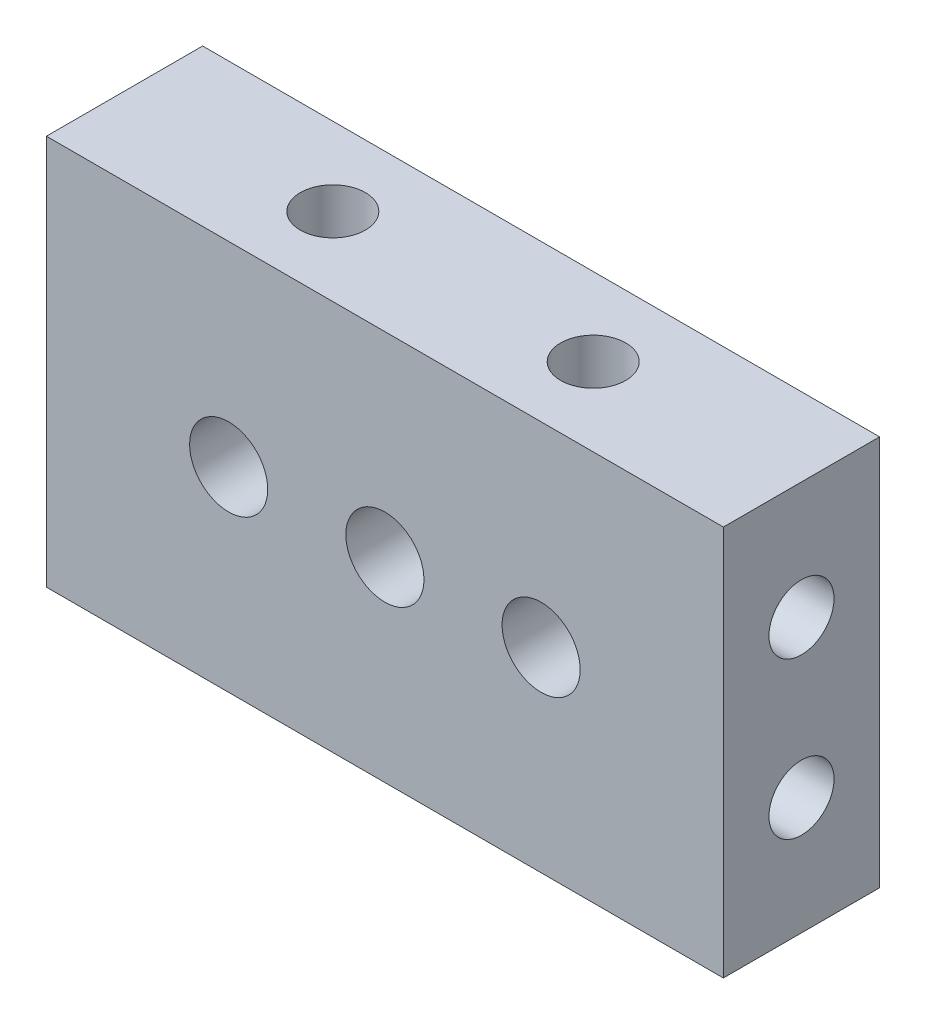
ISO-10303-21;
HEADER;
FILE_DESCRIPTION(('STEP AP214'),'2;1');
FILE_NAME('part.step','',(''),(''),'','','');
FILE_SCHEMA(('AUTOMOTIVE_DESIGN { 1 0 10303 214 1 1 1 1 }'));
ENDSEC;
DATA;
#1=APPLICATION_CONTEXT('core data for automotive mechanical design processes');
#2=APPLICATION_PROTOCOL_DEFINITION('international standard','automotive_design',2000,#1);
#3=PRODUCT_CONTEXT('',#1,'mechanical');
#4=PRODUCT('Part','Part','',(#3));
#5=PRODUCT_RELATED_PRODUCT_CATEGORY('part','',(#4));
#6=PRODUCT_DEFINITION_FORMATION('','',#4);
#7=PRODUCT_DEFINITION_CONTEXT('part definition',#1,'design');
#8=PRODUCT_DEFINITION('design','',#6,#7);
#9=PRODUCT_DEFINITION_SHAPE('','',#8);
#10=(LENGTH_UNIT() NAMED_UNIT(*) SI_UNIT(.MILLI.,.METRE.));
#11=(NAMED_UNIT(*) PLANE_ANGLE_UNIT() SI_UNIT($,.RADIAN.));
#12=(NAMED_UNIT(*) SI_UNIT($,.STERADIAN.) SOLID_ANGLE_UNIT());
#13=UNCERTAINTY_MEASURE_WITH_UNIT(LENGTH_MEASURE(1.E-05),#10,'distance_accuracy_value','');
#14=(GEOMETRIC_REPRESENTATION_CONTEXT(3) GLOBAL_UNCERTAINTY_ASSIGNED_CONTEXT((#13)) GLOBAL_UNIT_ASSIGNED_CONTEXT((#10,
#11,#12)) REPRESENTATION_CONTEXT('',''));
#15=CARTESIAN_POINT('',(0.,0.,0.));
#16=DIRECTION('',(0.,0.,1.));
#17=DIRECTION('',(1.,0.,0.));
#18=AXIS2_PLACEMENT_3D('',#15,#16,#17);
#19=CARTESIAN_POINT('',(13.,-7.5,5.));
#20=DIRECTION('',(-1.,0.,0.));
#21=DIRECTION('',(0.,0.,1.));
#22=AXIS2_PLACEMENT_3D('',#19,#20,#21);
#23=PLANE('',#22);
#24=CARTESIAN_POINT('',(13.,-3.,3.));
#25=DIRECTION('',(1.,0.,0.));
#26=DIRECTION('',(0.,0.,-1.));
#27=AXIS2_PLACEMENT_3D('',#24,#25,#26);
#28=CIRCLE('',#27,1.24999999999999);
#29=CARTESIAN_POINT('',(13.,-3.,1.75000000000001));
#30=VERTEX_POINT('',#29);
#31=EDGE_CURVE('E138',#30,#30,#28,.T.);
#32=ORIENTED_EDGE('',*,*,#31,.F.);
#33=EDGE_LOOP('',(#32));
#34=FACE_BOUND('',#33,.T.);
#35=CARTESIAN_POINT('',(13.,3.,3.));
#36=DIRECTION('',(1.,0.,0.));
#37=DIRECTION('',(0.,0.,-1.));
#38=AXIS2_PLACEMENT_3D('',#35,#36,#37);
#39=CIRCLE('',#38,1.24999999999999);
#40=CARTESIAN_POINT('',(13.,3.,1.75000000000001));
#41=VERTEX_POINT('',#40);
#42=EDGE_CURVE('E144',#41,#41,#39,.T.);
#43=ORIENTED_EDGE('',*,*,#42,.F.);
#44=EDGE_LOOP('',(#43));
#45=FACE_BOUND('',#44,.T.);
#46=DIRECTION('',(0.,1.,0.));
#47=VECTOR('',#46,1.);
#48=CARTESIAN_POINT('',(13.,-7.5,0.));
#49=LINE('',#48,#47);
#50=CARTESIAN_POINT('',(13.,-7.5,0.));
#51=VERTEX_POINT('',#50);
#52=CARTESIAN_POINT('',(13.,7.5,0.));
#53=VERTEX_POINT('',#52);
#54=EDGE_CURVE('E174',#51,#53,#49,.T.);
#55=ORIENTED_EDGE('',*,*,#54,.T.);
#56=DIRECTION('',(0.,0.,-1.));
#57=VECTOR('',#56,1.);
#58=CARTESIAN_POINT('',(13.,7.5,5.));
#59=LINE('',#58,#57);
#60=CARTESIAN_POINT('',(13.,7.5,6.));
#61=VERTEX_POINT('',#60);
#62=EDGE_CURVE('E192',#61,#53,#59,.T.);
#63=ORIENTED_EDGE('',*,*,#62,.F.);
#64=DIRECTION('',(0.,1.,0.));
#65=VECTOR('',#64,1.);
#66=CARTESIAN_POINT('',(13.,0.,6.));
#67=LINE('',#66,#65);
#68=CARTESIAN_POINT('',(13.,-7.5,6.));
#69=VERTEX_POINT('',#68);
#70=EDGE_CURVE('E165',#69,#61,#67,.T.);
#71=ORIENTED_EDGE('',*,*,#70,.F.);
#72=DIRECTION('',(0.,0.,-1.));
#73=VECTOR('',#72,1.);
#74=CARTESIAN_POINT('',(13.,-7.5,5.));
#75=LINE('',#74,#73);
#76=EDGE_CURVE('E183',#69,#51,#75,.T.);
#77=ORIENTED_EDGE('',*,*,#76,.T.);
#78=EDGE_LOOP('',(#55,#63,#71,#77));
#79=FACE_BOUND('',#78,.T.);
#80=ADVANCED_FACE('F39',(#34,#45,#79),#23,.F.);
#81=CARTESIAN_POINT('',(-13.,7.5,5.));
#82=DIRECTION('',(0.,-1.,0.));
#83=DIRECTION('',(0.,0.,-1.));
#84=AXIS2_PLACEMENT_3D('',#81,#82,#83);
#85=PLANE('',#84);
#86=CARTESIAN_POINT('',(5.,7.5,3.));
#87=DIRECTION('',(0.,1.,0.));
#88=DIRECTION('',(0.,0.,1.));
#89=AXIS2_PLACEMENT_3D('',#86,#87,#88);
#90=CIRCLE('',#89,1.24999999999999);
#91=CARTESIAN_POINT('',(5.,7.5,4.24999999999999));
#92=VERTEX_POINT('',#91);
#93=EDGE_CURVE('E112',#92,#92,#90,.T.);
#94=ORIENTED_EDGE('',*,*,#93,.F.);
#95=EDGE_LOOP('',(#94));
#96=FACE_BOUND('',#95,.T.);
#97=CARTESIAN_POINT('',(-5.,7.5,3.));
#98=DIRECTION('',(0.,1.,0.));
#99=DIRECTION('',(0.,0.,1.));
#100=AXIS2_PLACEMENT_3D('',#97,#98,#99);
#101=CIRCLE('',#100,1.24999999999999);
#102=CARTESIAN_POINT('',(-5.,7.5,4.24999999999999));
#103=VERTEX_POINT('',#102);
#104=EDGE_CURVE('E111',#103,#103,#101,.T.);
#105=ORIENTED_EDGE('',*,*,#104,.F.);
#106=EDGE_LOOP('',(#105));
#107=FACE_BOUND('',#106,.T.);
#108=DIRECTION('',(-1.,0.,0.));
#109=VECTOR('',#108,1.);
#110=CARTESIAN_POINT('',(-13.,7.5,0.));
#111=LINE('',#110,#109);
#112=CARTESIAN_POINT('',(-13.,7.5,0.));
#113=VERTEX_POINT('',#112);
#114=EDGE_CURVE('E177',#53,#113,#111,.T.);
#115=ORIENTED_EDGE('',*,*,#114,.T.);
#116=DIRECTION('',(0.,0.,-1.));
#117=VECTOR('',#116,1.);
#118=CARTESIAN_POINT('',(-13.,7.5,5.));
#119=LINE('',#118,#117);
#120=CARTESIAN_POINT('',(-13.,7.5,6.));
#121=VERTEX_POINT('',#120);
#122=EDGE_CURVE('E189',#121,#113,#119,.T.);
#123=ORIENTED_EDGE('',*,*,#122,.F.);
#124=DIRECTION('',(-1.,0.,0.));
#125=VECTOR('',#124,1.);
#126=CARTESIAN_POINT('',(0.,7.5,6.));
#127=LINE('',#126,#125);
#128=EDGE_CURVE('E168',#61,#121,#127,.T.);
#129=ORIENTED_EDGE('',*,*,#128,.F.);
#130=ORIENTED_EDGE('',*,*,#62,.T.);
#131=EDGE_LOOP('',(#115,#123,#129,#130));
#132=FACE_BOUND('',#131,.T.);
#133=ADVANCED_FACE('F237',(#96,#107,#132),#85,.F.);
#134=CARTESIAN_POINT('',(-13.,-7.5,5.));
#135=DIRECTION('',(1.,0.,0.));
#136=DIRECTION('',(0.,0.,-1.));
#137=AXIS2_PLACEMENT_3D('',#134,#135,#136);
#138=PLANE('',#137);
#139=CARTESIAN_POINT('',(-13.,-3.,3.));
#140=DIRECTION('',(-1.,0.,0.));
#141=DIRECTION('',(0.,0.,1.));
#142=AXIS2_PLACEMENT_3D('',#139,#140,#141);
#143=CIRCLE('',#142,1.24999999999999);
#144=CARTESIAN_POINT('',(-13.,-3.,4.24999999999999));
#145=VERTEX_POINT('',#144);
#146=EDGE_CURVE('E150',#145,#145,#143,.T.);
#147=ORIENTED_EDGE('',*,*,#146,.F.);
#148=EDGE_LOOP('',(#147));
#149=FACE_BOUND('',#148,.T.);
#150=CARTESIAN_POINT('',(-13.,3.,3.));
#151=DIRECTION('',(-1.,0.,0.));
#152=DIRECTION('',(0.,0.,1.));
#153=AXIS2_PLACEMENT_3D('',#150,#151,#152);
#154=CIRCLE('',#153,1.24999999999999);
#155=CARTESIAN_POINT('',(-13.,3.,4.24999999999999));
#156=VERTEX_POINT('',#155);
#157=EDGE_CURVE('E156',#156,#156,#154,.T.);
#158=ORIENTED_EDGE('',*,*,#157,.F.);
#159=EDGE_LOOP('',(#158));
#160=FACE_BOUND('',#159,.T.);
#161=DIRECTION('',(0.,-1.,0.));
#162=VECTOR('',#161,1.);
#163=CARTESIAN_POINT('',(-13.,-7.5,0.));
#164=LINE('',#163,#162);
#165=CARTESIAN_POINT('',(-13.,-7.5,0.));
#166=VERTEX_POINT('',#165);
#167=EDGE_CURVE('E179',#113,#166,#164,.T.);
#168=ORIENTED_EDGE('',*,*,#167,.T.);
#169=DIRECTION('',(0.,0.,-1.));
#170=VECTOR('',#169,1.);
#171=CARTESIAN_POINT('',(-13.,-7.5,5.));
#172=LINE('',#171,#170);
#173=CARTESIAN_POINT('',(-13.,-7.5,6.));
#174=VERTEX_POINT('',#173);
#175=EDGE_CURVE('E186',#174,#166,#172,.T.);
#176=ORIENTED_EDGE('',*,*,#175,.F.);
#177=DIRECTION('',(0.,-1.,0.));
#178=VECTOR('',#177,1.);
#179=CARTESIAN_POINT('',(-13.,0.,6.));
#180=LINE('',#179,#178);
#181=EDGE_CURVE('E171',#121,#174,#180,.T.);
#182=ORIENTED_EDGE('',*,*,#181,.F.);
#183=ORIENTED_EDGE('',*,*,#122,.T.);
#184=EDGE_LOOP('',(#168,#176,#182,#183));
#185=FACE_BOUND('',#184,.T.);
#186=ADVANCED_FACE('F242',(#149,#160,#185),#138,.F.);
#187=CARTESIAN_POINT('',(-13.,-7.5,5.));
#188=DIRECTION('',(0.,1.,0.));
#189=DIRECTION('',(0.,0.,1.));
#190=AXIS2_PLACEMENT_3D('',#187,#188,#189);
#191=PLANE('',#190);
#192=DIRECTION('',(1.,0.,0.));
#193=VECTOR('',#192,1.);
#194=CARTESIAN_POINT('',(-13.,-7.5,0.));
#195=LINE('',#194,#193);
#196=EDGE_CURVE('E181',#166,#51,#195,.T.);
#197=ORIENTED_EDGE('',*,*,#196,.T.);
#198=ORIENTED_EDGE('',*,*,#76,.F.);
#199=DIRECTION('',(1.,0.,0.));
#200=VECTOR('',#199,1.);
#201=CARTESIAN_POINT('',(0.,-7.5,6.));
#202=LINE('',#201,#200);
#203=EDGE_CURVE('E162',#174,#69,#202,.T.);
#204=ORIENTED_EDGE('',*,*,#203,.F.);
#205=ORIENTED_EDGE('',*,*,#175,.T.);
#206=EDGE_LOOP('',(#197,#198,#204,#205));
#207=FACE_BOUND('',#206,.T.);
#208=ADVANCED_FACE('F262',(#207),#191,.F.);
#209=CARTESIAN_POINT('',(0.,0.,0.));
#210=DIRECTION('',(0.,0.,-1.));
#211=DIRECTION('',(-1.,0.,0.));
#212=AXIS2_PLACEMENT_3D('',#209,#210,#211);
#213=PLANE('',#212);
#214=CARTESIAN_POINT('',(0.,0.,0.));
#215=DIRECTION('',(0.,0.,-1.));
#216=DIRECTION('',(-1.,0.,0.));
#217=AXIS2_PLACEMENT_3D('',#214,#215,#216);
#218=CIRCLE('',#217,1.5);
#219=CARTESIAN_POINT('',(-1.5,0.,0.));
#220=VERTEX_POINT('',#219);
#221=EDGE_CURVE('E127',#220,#220,#218,.T.);
#222=ORIENTED_EDGE('',*,*,#221,.F.);
#223=EDGE_LOOP('',(#222));
#224=FACE_BOUND('',#223,.T.);
#225=CARTESIAN_POINT('',(6.,0.,0.));
#226=DIRECTION('',(0.,0.,-1.));
#227=DIRECTION('',(-1.,0.,0.));
#228=AXIS2_PLACEMENT_3D('',#225,#226,#227);
#229=CIRCLE('',#228,1.5);
#230=CARTESIAN_POINT('',(4.5,0.,0.));
#231=VERTEX_POINT('',#230);
#232=EDGE_CURVE('E125',#231,#231,#229,.T.);
#233=ORIENTED_EDGE('',*,*,#232,.F.);
#234=EDGE_LOOP('',(#233));
#235=FACE_BOUND('',#234,.T.);
#236=CARTESIAN_POINT('',(-6.,0.,0.));
#237=DIRECTION('',(0.,0.,-1.));
#238=DIRECTION('',(-1.,0.,0.));
#239=AXIS2_PLACEMENT_3D('',#236,#237,#238);
#240=CIRCLE('',#239,1.5);
#241=CARTESIAN_POINT('',(-7.5,0.,0.));
#242=VERTEX_POINT('',#241);
#243=EDGE_CURVE('E133',#242,#242,#240,.T.);
#244=ORIENTED_EDGE('',*,*,#243,.F.);
#245=EDGE_LOOP('',(#244));
#246=FACE_BOUND('',#245,.T.);
#247=ORIENTED_EDGE('',*,*,#54,.F.);
#248=ORIENTED_EDGE('',*,*,#196,.F.);
#249=ORIENTED_EDGE('',*,*,#167,.F.);
#250=ORIENTED_EDGE('',*,*,#114,.F.);
#251=EDGE_LOOP('',(#247,#248,#249,#250));
#252=FACE_BOUND('',#251,.T.);
#253=ADVANCED_FACE('F252',(#224,#235,#246,#252),#213,.T.);
#254=CARTESIAN_POINT('',(0.,0.,6.));
#255=DIRECTION('',(0.,0.,1.));
#256=DIRECTION('',(1.,0.,0.));
#257=AXIS2_PLACEMENT_3D('',#254,#255,#256);
#258=PLANE('',#257);
#259=CARTESIAN_POINT('',(0.,0.,6.));
#260=DIRECTION('',(0.,0.,1.));
#261=DIRECTION('',(1.,0.,0.));
#262=AXIS2_PLACEMENT_3D('',#259,#260,#261);
#263=CIRCLE('',#262,1.5);
#264=CARTESIAN_POINT('',(1.5,0.,6.));
#265=VERTEX_POINT('',#264);
#266=EDGE_CURVE('E137',#265,#265,#263,.T.);
#267=ORIENTED_EDGE('',*,*,#266,.F.);
#268=EDGE_LOOP('',(#267));
#269=FACE_BOUND('',#268,.T.);
#270=CARTESIAN_POINT('',(6.,0.,6.));
#271=DIRECTION('',(0.,0.,1.));
#272=DIRECTION('',(1.,0.,0.));
#273=AXIS2_PLACEMENT_3D('',#270,#271,#272);
#274=CIRCLE('',#273,1.5);
#275=CARTESIAN_POINT('',(7.5,0.,6.));
#276=VERTEX_POINT('',#275);
#277=EDGE_CURVE('E122',#276,#276,#274,.T.);
#278=ORIENTED_EDGE('',*,*,#277,.F.);
#279=EDGE_LOOP('',(#278));
#280=FACE_BOUND('',#279,.T.);
#281=CARTESIAN_POINT('',(-6.,0.,6.));
#282=DIRECTION('',(0.,0.,1.));
#283=DIRECTION('',(1.,0.,0.));
#284=AXIS2_PLACEMENT_3D('',#281,#282,#283);
#285=CIRCLE('',#284,1.5);
#286=CARTESIAN_POINT('',(-4.5,0.,6.));
#287=VERTEX_POINT('',#286);
#288=EDGE_CURVE('E136',#287,#287,#285,.T.);
#289=ORIENTED_EDGE('',*,*,#288,.F.);
#290=EDGE_LOOP('',(#289));
#291=FACE_BOUND('',#290,.T.);
#292=ORIENTED_EDGE('',*,*,#203,.T.);
#293=ORIENTED_EDGE('',*,*,#70,.T.);
#294=ORIENTED_EDGE('',*,*,#128,.T.);
#295=ORIENTED_EDGE('',*,*,#181,.T.);
#296=EDGE_LOOP('',(#292,#293,#294,#295));
#297=FACE_BOUND('',#296,.T.);
#298=ADVANCED_FACE('F258',(#269,#280,#291,#297),#258,.T.);
#299=CARTESIAN_POINT('',(-8.,3.,3.));
#300=DIRECTION('',(-1.,0.,0.));
#301=DIRECTION('',(0.,0.,1.));
#302=AXIS2_PLACEMENT_3D('',#299,#300,#301);
#303=CONICAL_SURFACE('',#302,1.25,1.02974425867665);
#304=CARTESIAN_POINT('',(-7.24892422621555,3.,3.));
#305=VERTEX_POINT('',#304);
#306=VERTEX_LOOP('',#305);
#307=FACE_BOUND('',#306,.T.);
#308=CARTESIAN_POINT('',(-8.,3.,3.));
#309=DIRECTION('',(-1.,0.,0.));
#310=DIRECTION('',(0.,0.,1.));
#311=AXIS2_PLACEMENT_3D('',#308,#309,#310);
#312=CIRCLE('',#311,1.25);
#313=CARTESIAN_POINT('',(-8.,3.,4.25));
#314=VERTEX_POINT('',#313);
#315=EDGE_CURVE('E159',#314,#314,#312,.T.);
#316=ORIENTED_EDGE('',*,*,#315,.T.);
#317=EDGE_LOOP('',(#316));
#318=FACE_BOUND('',#317,.T.);
#319=ADVANCED_FACE('F276',(#307,#318),#303,.F.);
#320=CARTESIAN_POINT('',(-13.,3.,3.));
#321=DIRECTION('',(-1.,0.,0.));
#322=DIRECTION('',(0.,0.,1.));
#323=AXIS2_PLACEMENT_3D('',#320,#321,#322);
#324=CYLINDRICAL_SURFACE('',#323,1.24999999999999);
#325=ORIENTED_EDGE('',*,*,#315,.F.);
#326=EDGE_LOOP('',(#325));
#327=FACE_BOUND('',#326,.T.);
#328=ORIENTED_EDGE('',*,*,#157,.T.);
#329=EDGE_LOOP('',(#328));
#330=FACE_BOUND('',#329,.T.);
#331=ADVANCED_FACE('F280',(#327,#330),#324,.F.);
#332=CARTESIAN_POINT('',(-8.,-3.,3.));
#333=DIRECTION('',(-1.,0.,0.));
#334=DIRECTION('',(0.,0.,1.));
#335=AXIS2_PLACEMENT_3D('',#332,#333,#334);
#336=CONICAL_SURFACE('',#335,1.25,1.02974425867665);
#337=CARTESIAN_POINT('',(-7.24892422621555,-3.,3.));
#338=VERTEX_POINT('',#337);
#339=VERTEX_LOOP('',#338);
#340=FACE_BOUND('',#339,.T.);
#341=CARTESIAN_POINT('',(-8.,-3.,3.));
#342=DIRECTION('',(-1.,0.,0.));
#343=DIRECTION('',(0.,0.,1.));
#344=AXIS2_PLACEMENT_3D('',#341,#342,#343);
#345=CIRCLE('',#344,1.25);
#346=CARTESIAN_POINT('',(-8.,-3.,4.25));
#347=VERTEX_POINT('',#346);
#348=EDGE_CURVE('E153',#347,#347,#345,.T.);
#349=ORIENTED_EDGE('',*,*,#348,.T.);
#350=EDGE_LOOP('',(#349));
#351=FACE_BOUND('',#350,.T.);
#352=ADVANCED_FACE('F284',(#340,#351),#336,.F.);
#353=CARTESIAN_POINT('',(-13.,-3.,3.));
#354=DIRECTION('',(-1.,0.,0.));
#355=DIRECTION('',(0.,0.,1.));
#356=AXIS2_PLACEMENT_3D('',#353,#354,#355);
#357=CYLINDRICAL_SURFACE('',#356,1.24999999999999);
#358=ORIENTED_EDGE('',*,*,#348,.F.);
#359=EDGE_LOOP('',(#358));
#360=FACE_BOUND('',#359,.T.);
#361=ORIENTED_EDGE('',*,*,#146,.T.);
#362=EDGE_LOOP('',(#361));
#363=FACE_BOUND('',#362,.T.);
#364=ADVANCED_FACE('F288',(#360,#363),#357,.F.);
#365=CARTESIAN_POINT('',(8.,3.,3.));
#366=DIRECTION('',(1.,0.,0.));
#367=DIRECTION('',(0.,0.,-1.));
#368=AXIS2_PLACEMENT_3D('',#365,#366,#367);
#369=CONICAL_SURFACE('',#368,1.25,1.02974425867665);
#370=CARTESIAN_POINT('',(7.24892422621555,3.,3.));
#371=VERTEX_POINT('',#370);
#372=VERTEX_LOOP('',#371);
#373=FACE_BOUND('',#372,.T.);
#374=CARTESIAN_POINT('',(8.,3.,3.));
#375=DIRECTION('',(1.,0.,0.));
#376=DIRECTION('',(0.,0.,-1.));
#377=AXIS2_PLACEMENT_3D('',#374,#375,#376);
#378=CIRCLE('',#377,1.25);
#379=CARTESIAN_POINT('',(8.,3.,1.75));
#380=VERTEX_POINT('',#379);
#381=EDGE_CURVE('E147',#380,#380,#378,.T.);
#382=ORIENTED_EDGE('',*,*,#381,.T.);
#383=EDGE_LOOP('',(#382));
#384=FACE_BOUND('',#383,.T.);
#385=ADVANCED_FACE('F292',(#373,#384),#369,.F.);
#386=CARTESIAN_POINT('',(13.,3.,3.));
#387=DIRECTION('',(1.,0.,0.));
#388=DIRECTION('',(0.,0.,-1.));
#389=AXIS2_PLACEMENT_3D('',#386,#387,#388);
#390=CYLINDRICAL_SURFACE('',#389,1.24999999999999);
#391=ORIENTED_EDGE('',*,*,#381,.F.);
#392=EDGE_LOOP('',(#391));
#393=FACE_BOUND('',#392,.T.);
#394=ORIENTED_EDGE('',*,*,#42,.T.);
#395=EDGE_LOOP('',(#394));
#396=FACE_BOUND('',#395,.T.);
#397=ADVANCED_FACE('F296',(#393,#396),#390,.F.);
#398=CARTESIAN_POINT('',(8.,-3.,3.));
#399=DIRECTION('',(1.,0.,0.));
#400=DIRECTION('',(0.,0.,-1.));
#401=AXIS2_PLACEMENT_3D('',#398,#399,#400);
#402=CONICAL_SURFACE('',#401,1.25,1.02974425867665);
#403=CARTESIAN_POINT('',(7.24892422621555,-3.,3.));
#404=VERTEX_POINT('',#403);
#405=VERTEX_LOOP('',#404);
#406=FACE_BOUND('',#405,.T.);
#407=CARTESIAN_POINT('',(8.,-3.,3.));
#408=DIRECTION('',(1.,0.,0.));
#409=DIRECTION('',(0.,0.,-1.));
#410=AXIS2_PLACEMENT_3D('',#407,#408,#409);
#411=CIRCLE('',#410,1.25);
#412=CARTESIAN_POINT('',(8.,-3.,1.75));
#413=VERTEX_POINT('',#412);
#414=EDGE_CURVE('E141',#413,#413,#411,.T.);
#415=ORIENTED_EDGE('',*,*,#414,.T.);
#416=EDGE_LOOP('',(#415));
#417=FACE_BOUND('',#416,.T.);
#418=ADVANCED_FACE('F300',(#406,#417),#402,.F.);
#419=CARTESIAN_POINT('',(13.,-3.,3.));
#420=DIRECTION('',(1.,0.,0.));
#421=DIRECTION('',(0.,0.,-1.));
#422=AXIS2_PLACEMENT_3D('',#419,#420,#421);
#423=CYLINDRICAL_SURFACE('',#422,1.24999999999999);
#424=ORIENTED_EDGE('',*,*,#414,.F.);
#425=EDGE_LOOP('',(#424));
#426=FACE_BOUND('',#425,.T.);
#427=ORIENTED_EDGE('',*,*,#31,.T.);
#428=EDGE_LOOP('',(#427));
#429=FACE_BOUND('',#428,.T.);
#430=ADVANCED_FACE('F303',(#426,#429),#423,.F.);
#431=CARTESIAN_POINT('',(-6.,0.,7.));
#432=DIRECTION('',(0.,0.,-1.));
#433=DIRECTION('',(-1.,0.,0.));
#434=AXIS2_PLACEMENT_3D('',#431,#432,#433);
#435=CYLINDRICAL_SURFACE('',#434,1.5);
#436=CARTESIAN_POINT('',(-4.6147125960975,0.575307577378452,4.3202628832556));
#437=CARTESIAN_POINT('',(-4.60173741524055,0.544076760306049,4.26227722935373));
#438=CARTESIAN_POINT('',(-4.59004306886682,0.51292405926726,4.20396675571866));
#439=CARTESIAN_POINT('',(-4.56905642075062,0.451069865192346,4.08663500274302));
#440=CARTESIAN_POINT('',(-4.55976545801076,0.420368632628252,4.02761334626027));
#441=CARTESIAN_POINT('',(-4.54318618195258,0.358805131312502,3.9070159234638));
#442=CARTESIAN_POINT('',(-4.53596913607845,0.327967548017478,3.84541781012317));
#443=CARTESIAN_POINT('',(-4.52377720091937,0.267774343386469,3.72129481337329));
#444=CARTESIAN_POINT('',(-4.51880156538814,0.23841823170992,3.6587702455857));
#445=CARTESIAN_POINT('',(-4.51274110085239,0.195670419595495,3.56204708973534));
#446=CARTESIAN_POINT('',(-4.51092666894482,0.181259593659023,3.52834535219004));
#447=CARTESIAN_POINT('',(-4.50782165131997,0.153611168366112,3.46044327641354));
#448=CARTESIAN_POINT('',(-4.5065309411325,0.140373290826456,3.42624305865752));
#449=CARTESIAN_POINT('',(-4.50442028024863,0.115727107371944,3.35751908543131));
#450=CARTESIAN_POINT('',(-4.50359613112692,0.104303172601964,3.32300115161534));
#451=CARTESIAN_POINT('',(-4.50231596524119,0.0839456652816564,3.25322307176391));
#452=CARTESIAN_POINT('',(-4.50185976047476,0.0750108224510659,3.21796331422813));
#453=CARTESIAN_POINT('',(-4.50129135796101,0.0624651777169226,3.15562019211188));
#454=CARTESIAN_POINT('',(-4.50112167689263,0.0580818349244477,3.12869600463794));
#455=CARTESIAN_POINT('',(-4.50088877641849,0.0517301973269372,3.07456535048869));
#456=CARTESIAN_POINT('',(-4.50082550933658,0.0497608211113045,3.04735901572259));
#457=CARTESIAN_POINT('',(-4.50078311402441,0.0484692776879346,2.99290271795126));
#458=CARTESIAN_POINT('',(-4.50080391869919,0.0491449994989062,2.96565280707866));
#459=CARTESIAN_POINT('',(-4.50093737129487,0.0530543534650906,2.91133947506621));
#460=CARTESIAN_POINT('',(-4.50105003893265,0.0562885347473816,2.88427609521988));
#461=CARTESIAN_POINT('',(-4.50156428498341,0.0689884929117762,2.80558200315309));
#462=CARTESIAN_POINT('',(-4.50213690300821,0.081451843968875,2.7544458605731));
#463=CARTESIAN_POINT('',(-4.50406891744085,0.111411820564605,2.65366975662341));
#464=CARTESIAN_POINT('',(-4.50543042769605,0.128921905292242,2.60403419352675));
#465=CARTESIAN_POINT('',(-4.50921084281628,0.167107587415875,2.5050645842264));
#466=CARTESIAN_POINT('',(-4.51164772881285,0.187832949905035,2.45575080138711));
#467=CARTESIAN_POINT('',(-4.51772840282485,0.230967529566834,2.35802632462433));
#468=CARTESIAN_POINT('',(-4.52137072532086,0.253374676643464,2.30961460912959));
#469=CARTESIAN_POINT('',(-4.53016069318536,0.300280674245952,2.2111922557207));
#470=CARTESIAN_POINT('',(-4.53536986392388,0.324828329286159,2.16121047649627));
#471=CARTESIAN_POINT('',(-4.54731080481902,0.374634268883709,2.06176607163877));
#472=CARTESIAN_POINT('',(-4.55404308299016,0.399892788074553,2.01230362499601));
#473=CARTESIAN_POINT('',(-4.56887477331006,0.450047810222754,1.91540440203663));
#474=CARTESIAN_POINT('',(-4.57692438906013,0.474930618514718,1.86795292765237));
#475=CARTESIAN_POINT('',(-4.59460884501201,0.524957251976637,1.77350731478653));
#476=CARTESIAN_POINT('',(-4.60424312479797,0.550100981937032,1.72651302082393));
#477=CARTESIAN_POINT('',(-4.6147125960975,0.575307577378452,1.67973711674441));
#478=B_SPLINE_CURVE_WITH_KNOTS('',3,(#436,#437,#438,#439,#440,#441,#442,#443,#444,#445,#446,
#447,#448,#449,#450,#451,#452,#453,#454,#455,#456,#457,#458,#459,#460,#461,#462,#463,#464,#465,
#466,#467,#468,#469,#470,#471,#472,#473,#474,#475,#476,#477),.UNSPECIFIED.,.F.,.F.,(4,2,2,2,2,2,
2,2,2,2,2,2,2,2,2,2,2,2,2,2,4),(0.,0.201364064606969,0.40284007518307,0.610581890931796,
0.818254490732741,0.928331992431177,1.03838331724196,1.14742790933542,1.25641674936649,
1.33816367791416,1.41987397201027,1.50151906862782,1.58318169364559,1.74058426502729,
1.89841056204918,2.05898220473699,2.2193593438836,2.38711214200409,2.55492097479796,
2.71743899821795,2.87989967028991),.UNSPECIFIED.);
#479=CARTESIAN_POINT('',(-4.58578643762691,0.500000000000007,4.17937573518628));
#480=VERTEX_POINT('',#479);
#481=CARTESIAN_POINT('',(-4.5857864376269,0.500000000000011,1.82062426481372));
#482=VERTEX_POINT('',#481);
#483=EDGE_CURVE('E195',#480,#482,#478,.T.);
#484=ORIENTED_EDGE('',*,*,#483,.T.);
#485=CARTESIAN_POINT('',(-4.58578643762691,0.500000000000007,1.82062426481373));
#486=CARTESIAN_POINT('',(-4.59956744607161,0.53896663476751,1.81579087976923));
#487=CARTESIAN_POINT('',(-4.61493175789957,0.577307294847742,1.81065910380487));
#488=CARTESIAN_POINT('',(-4.64876585061154,0.65259076062681,1.80022834270513));
#489=CARTESIAN_POINT('',(-4.66723702981257,0.689532927689095,1.79492928315618));
#490=CARTESIAN_POINT('',(-4.72739929310637,0.798354290700735,1.77938139991832));
#491=CARTESIAN_POINT('',(-4.77369918456567,0.867832796828611,1.76953923081909));
#492=CARTESIAN_POINT('',(-4.86927378950179,0.988128998987135,1.75607189867506));
#493=CARTESIAN_POINT('',(-4.91692453824716,1.04016099410575,1.75171048190409));
#494=CARTESIAN_POINT('',(-5.01908018360024,1.13697558189805,1.74910871379132));
#495=CARTESIAN_POINT('',(-5.0735617684596,1.18178169867691,1.75084806245962));
#496=CARTESIAN_POINT('',(-5.17888212249829,1.25669364949216,1.76191443311887));
#497=CARTESIAN_POINT('',(-5.22899035141763,1.28800066734617,1.77003204402664));
#498=CARTESIAN_POINT('',(-5.33123271978797,1.34392683891028,1.79354637469149));
#499=CARTESIAN_POINT('',(-5.38336660591553,1.36854682582582,1.80894218692744));
#500=CARTESIAN_POINT('',(-5.48763042602989,1.41090497674491,1.84769182049721));
#501=CARTESIAN_POINT('',(-5.53976010845524,1.42862816758059,1.87106275203128));
#502=CARTESIAN_POINT('',(-5.64164344764909,1.45752842271565,1.92569290431579));
#503=CARTESIAN_POINT('',(-5.69139665134249,1.4687042432995,1.95695362216982));
#504=CARTESIAN_POINT('',(-5.78496333034068,1.4852428319197,2.02553187221899));
#505=CARTESIAN_POINT('',(-5.82891927956027,1.49078649605985,2.06261350653053));
#506=CARTESIAN_POINT('',(-5.91146079102243,1.49795864120814,2.14265052059451));
#507=CARTESIAN_POINT('',(-5.95004454666563,1.49958580813045,2.18560786669206));
#508=CARTESIAN_POINT('',(-6.02430807874795,1.50030656137326,2.28078139497739));
#509=CARTESIAN_POINT('',(-6.05935853999946,1.49914332519591,2.3334900236776));
#510=CARTESIAN_POINT('',(-6.12109783894808,1.49542433934361,2.44355863466324));
#511=CARTESIAN_POINT('',(-6.14778259188021,1.492867911071,2.50092087203564));
#512=CARTESIAN_POINT('',(-6.1943978068345,1.487554630073,2.62487710835362));
#513=CARTESIAN_POINT('',(-6.21339965451152,1.48480295033315,2.69182312564523));
#514=CARTESIAN_POINT('',(-6.24004822825446,1.48072988833447,2.82797536822466));
#515=CARTESIAN_POINT('',(-6.24769586856205,1.47940839091959,2.8971814110764));
#516=CARTESIAN_POINT('',(-6.25142304221321,1.47878029984437,3.03644891988553));
#517=CARTESIAN_POINT('',(-6.24741360148794,1.47948920284561,3.10651287918773));
#518=CARTESIAN_POINT('',(-6.22775717530392,1.4826405599756,3.24495493797937));
#519=CARTESIAN_POINT('',(-6.21210785863616,1.48508336136125,3.31333269692566));
#520=CARTESIAN_POINT('',(-6.16970309289915,1.49052085118524,3.44625708965948));
#521=CARTESIAN_POINT('',(-6.1429870548,1.49351356044849,3.51081639864901));
#522=CARTESIAN_POINT('',(-6.07914991221065,1.4982509969334,3.63465612372729));
#523=CARTESIAN_POINT('',(-6.04202591025362,1.49999537615211,3.69393506375309));
#524=CARTESIAN_POINT('',(-5.95819179177335,1.50000461680126,3.80577465020254));
#525=CARTESIAN_POINT('',(-5.91143658119417,1.49825276058227,3.85830173352339));
#526=CARTESIAN_POINT('',(-5.81010165848861,1.48879579620503,3.95451544503493));
#527=CARTESIAN_POINT('',(-5.7555312931364,1.48109775193082,3.99821248538372));
#528=CARTESIAN_POINT('',(-5.64642561755957,1.45869386252206,4.07170477061094));
#529=CARTESIAN_POINT('',(-5.59236089391282,1.4447078802391,4.10241601034368));
#530=CARTESIAN_POINT('',(-5.48241567641274,1.40905483164282,4.15476261100389));
#531=CARTESIAN_POINT('',(-5.42653617200056,1.38739188910201,4.17640283094387));
#532=CARTESIAN_POINT('',(-5.32093616186599,1.33863195992892,4.20924446420475));
#533=CARTESIAN_POINT('',(-5.27113103331022,1.31223843602772,4.22123674858205));
#534=CARTESIAN_POINT('',(-5.17404850376294,1.25340638129733,4.23880698797123));
#535=CARTESIAN_POINT('',(-5.12677154050748,1.22096680796558,4.24438383559699));
#536=CARTESIAN_POINT('',(-5.03330664673422,1.14856907184007,4.25048751318429));
#537=CARTESIAN_POINT('',(-4.98736166195058,1.10827267305103,4.25068504181856));
#538=CARTESIAN_POINT('',(-4.90079109946469,1.02247866301813,4.2468117455534));
#539=CARTESIAN_POINT('',(-4.86017135590212,0.976975447880149,4.24273628256587));
#540=CARTESIAN_POINT('',(-4.77760997839836,0.87236537378418,4.23089503596022));
#541=CARTESIAN_POINT('',(-4.73692968010134,0.812328905008151,4.22256832426277));
#542=CARTESIAN_POINT('',(-4.66474368210553,0.687237266303174,4.20477698071698));
#543=CARTESIAN_POINT('',(-4.63322466584017,0.622189556450505,4.1953140290551));
#544=CARTESIAN_POINT('',(-4.59925718304415,0.536942549492246,4.18404456448107));
#545=CARTESIAN_POINT('',(-4.59233956254834,0.51853710961249,4.18167560317512));
#546=CARTESIAN_POINT('',(-4.58578643762691,0.500000000000007,4.17937573518628));
#547=B_SPLINE_CURVE_WITH_KNOTS('',3,(#485,#486,#487,#488,#489,#490,#491,#492,#493,#494,#495,
#496,#497,#498,#499,#500,#501,#502,#503,#504,#505,#506,#507,#508,#509,#510,#511,#512,#513,#514,
#515,#516,#517,#518,#519,#520,#521,#522,#523,#524,#525,#526,#527,#528,#529,#530,#531,#532,#533,
#534,#535,#536,#537,#538,#539,#540,#541,#542,#543,#544,#545,#546),.UNSPECIFIED.,.F.,.F.,(4,2,2,
2,2,2,2,2,2,2,2,2,2,2,2,2,2,2,2,2,2,2,2,2,2,2,2,2,2,2,4),(0.,0.124752274607862,
0.249560847823708,0.500433578172283,0.711695322812495,0.922254772462498,1.10039690575206,
1.27851683230185,1.4570213338311,1.63555973246532,1.80816286768348,1.98082390763639,
2.16997561760839,2.35921954227295,2.567173490813,2.77511069397655,2.9846391593417,
3.19420959991498,3.40304004536587,3.61192868482645,3.82181854231229,4.03145944001923,
4.22156506513972,4.41156872711545,4.58368709287066,4.75583516399288,4.93849925074337,
5.12136181438253,5.33956032720699,5.55744006860647,5.61683780865236),.UNSPECIFIED.);
#548=EDGE_CURVE('E108',#482,#480,#547,.T.);
#549=ORIENTED_EDGE('',*,*,#548,.T.);
#550=EDGE_LOOP('',(#484,#549));
#551=FACE_BOUND('',#550,.T.);
#552=ORIENTED_EDGE('',*,*,#288,.T.);
#553=EDGE_LOOP('',(#552));
#554=FACE_BOUND('',#553,.T.);
#555=ORIENTED_EDGE('',*,*,#243,.T.);
#556=EDGE_LOOP('',(#555));
#557=FACE_BOUND('',#556,.T.);
#558=ADVANCED_FACE('F118',(#551,#554,#557),#435,.F.);
#559=CARTESIAN_POINT('',(6.,0.,7.));
#560=DIRECTION('',(0.,0.,-1.));
#561=DIRECTION('',(-1.,0.,0.));
#562=AXIS2_PLACEMENT_3D('',#559,#560,#561);
#563=CYLINDRICAL_SURFACE('',#562,1.5);
#564=CARTESIAN_POINT('',(4.6147125960975,0.575307577378452,1.67973711674441));
#565=CARTESIAN_POINT('',(4.60173741524055,0.544076760306049,1.73772277064628));
#566=CARTESIAN_POINT('',(4.59004306886682,0.51292405926726,1.79603324428135));
#567=CARTESIAN_POINT('',(4.56905642075061,0.451069865192346,1.91336499725699));
#568=CARTESIAN_POINT('',(4.55976545801076,0.420368632628252,1.97238665373973));
#569=CARTESIAN_POINT('',(4.54318618195258,0.358805131312502,2.09298407653621));
#570=CARTESIAN_POINT('',(4.53596913607845,0.327967548017478,2.15458218987684));
#571=CARTESIAN_POINT('',(4.52377720091937,0.267774343386469,2.27870518662672));
#572=CARTESIAN_POINT('',(4.51880156538814,0.23841823170992,2.3412297544143));
#573=CARTESIAN_POINT('',(4.51274110085239,0.195670419595495,2.43795291026466));
#574=CARTESIAN_POINT('',(4.51092666894482,0.181259593659024,2.47165464780996));
#575=CARTESIAN_POINT('',(4.50782165131997,0.153611168366112,2.53955672358646));
#576=CARTESIAN_POINT('',(4.5065309411325,0.140373290826456,2.57375694134249));
#577=CARTESIAN_POINT('',(4.50442028024863,0.115727107371944,2.6424809145687));
#578=CARTESIAN_POINT('',(4.50359613112692,0.104303172601965,2.67699884838467));
#579=CARTESIAN_POINT('',(4.50231596524119,0.0839456652816568,2.74677692823609));
#580=CARTESIAN_POINT('',(4.50185976047476,0.0750108224510662,2.78203668577188));
#581=CARTESIAN_POINT('',(4.50129135796101,0.062465177716923,2.84437980788812));
#582=CARTESIAN_POINT('',(4.50112167689263,0.0580818349244482,2.87130399536207));
#583=CARTESIAN_POINT('',(4.50088877641849,0.0517301973269378,2.92543464951132));
#584=CARTESIAN_POINT('',(4.50082550933658,0.0497608211113051,2.95264098427742));
#585=CARTESIAN_POINT('',(4.50078311402441,0.0484692776879352,3.00709728204874));
#586=CARTESIAN_POINT('',(4.50080391869919,0.0491449994989069,3.03434719292135));
#587=CARTESIAN_POINT('',(4.50093737129487,0.0530543534650915,3.0886605249338));
#588=CARTESIAN_POINT('',(4.50105003893265,0.0562885347473825,3.11572390478013));
#589=CARTESIAN_POINT('',(4.50156428498341,0.0689884929117772,3.19441799684692));
#590=CARTESIAN_POINT('',(4.50213690300821,0.0814518439688764,3.2455541394269));
#591=CARTESIAN_POINT('',(4.50406891744085,0.111411820564607,3.3463302433766));
#592=CARTESIAN_POINT('',(4.50543042769605,0.128921905292245,3.39596580647325));
#593=CARTESIAN_POINT('',(4.50921084281628,0.167107587415878,3.49493541577361));
#594=CARTESIAN_POINT('',(4.51164772881285,0.187832949905038,3.5442491986129));
#595=CARTESIAN_POINT('',(4.51772840282485,0.230967529566838,3.64197367537568));
#596=CARTESIAN_POINT('',(4.52137072532086,0.253374676643469,3.69038539087042));
#597=CARTESIAN_POINT('',(4.53016069318536,0.300280674245956,3.78880774427931));
#598=CARTESIAN_POINT('',(4.53536986392388,0.324828329286163,3.83878952350374));
#599=CARTESIAN_POINT('',(4.54731080481902,0.374634268883712,3.93823392836124));
#600=CARTESIAN_POINT('',(4.55404308299016,0.399892788074555,3.987696375004));
#601=CARTESIAN_POINT('',(4.56887477331006,0.450047810222755,4.08459559796338));
#602=CARTESIAN_POINT('',(4.57692438906013,0.47493061851472,4.13204707234764));
#603=CARTESIAN_POINT('',(4.59460884501201,0.524957251976637,4.22649268521348));
#604=CARTESIAN_POINT('',(4.60424312479797,0.550100981937032,4.27348697917607));
#605=CARTESIAN_POINT('',(4.6147125960975,0.575307577378452,4.32026288325559));
#606=B_SPLINE_CURVE_WITH_KNOTS('',3,(#564,#565,#566,#567,#568,#569,#570,#571,#572,#573,#574,
#575,#576,#577,#578,#579,#580,#581,#582,#583,#584,#585,#586,#587,#588,#589,#590,#591,#592,#593,
#594,#595,#596,#597,#598,#599,#600,#601,#602,#603,#604,#605),.UNSPECIFIED.,.F.,.F.,(4,2,2,2,2,2,
2,2,2,2,2,2,2,2,2,2,2,2,2,2,4),(0.,0.201364064606969,0.402840075183071,0.610581890931795,
0.81825449073274,0.928331992431176,1.03838331724196,1.14742790933542,1.2564167493665,
1.33816367791416,1.41987397201027,1.50151906862783,1.58318169364559,1.7405842650273,
1.89841056204918,2.05898220473699,2.21935934388361,2.3871121420041,2.55492097479797,
2.71743899821795,2.87989967028991),.UNSPECIFIED.);
#607=CARTESIAN_POINT('',(4.58578643762691,0.500000000000007,1.82062426481373));
#608=VERTEX_POINT('',#607);
#609=CARTESIAN_POINT('',(4.5857864376269,0.500000000000011,4.17937573518629));
#610=VERTEX_POINT('',#609);
#611=EDGE_CURVE('E51',#608,#610,#606,.T.);
#612=ORIENTED_EDGE('',*,*,#611,.T.);
#613=CARTESIAN_POINT('',(4.58578643762691,0.500000000000007,4.17937573518628));
#614=CARTESIAN_POINT('',(4.59956744607161,0.53896663476751,4.18420912023077));
#615=CARTESIAN_POINT('',(4.61493175789957,0.577307294847743,4.18934089619513));
#616=CARTESIAN_POINT('',(4.64876585061154,0.65259076062681,4.19977165729487));
#617=CARTESIAN_POINT('',(4.66723702981257,0.689532927689095,4.20507071684383));
#618=CARTESIAN_POINT('',(4.72739929310637,0.798354290700736,4.22061860008169));
#619=CARTESIAN_POINT('',(4.77369918456567,0.867832796828612,4.23046076918091));
#620=CARTESIAN_POINT('',(4.86927378950179,0.988128998987135,4.24392810132494));
#621=CARTESIAN_POINT('',(4.91692453824716,1.04016099410575,4.24828951809592));
#622=CARTESIAN_POINT('',(5.01908018360024,1.13697558189805,4.25089128620868));
#623=CARTESIAN_POINT('',(5.0735617684596,1.18178169867691,4.24915193754039));
#624=CARTESIAN_POINT('',(5.17888212249829,1.25669364949216,4.23808556688114));
#625=CARTESIAN_POINT('',(5.22899035141763,1.28800066734617,4.22996795597336));
#626=CARTESIAN_POINT('',(5.33123271978797,1.34392683891028,4.20645362530852));
#627=CARTESIAN_POINT('',(5.38336660591553,1.36854682582582,4.19105781307256));
#628=CARTESIAN_POINT('',(5.48763042602989,1.41090497674491,4.1523081795028));
#629=CARTESIAN_POINT('',(5.53976010845524,1.42862816758059,4.12893724796872));
#630=CARTESIAN_POINT('',(5.64164344764909,1.45752842271565,4.07430709568421));
#631=CARTESIAN_POINT('',(5.6913966513425,1.4687042432995,4.04304637783018));
#632=CARTESIAN_POINT('',(5.78496333034068,1.4852428319197,3.97446812778102));
#633=CARTESIAN_POINT('',(5.82891927956028,1.49078649605985,3.93738649346948));
#634=CARTESIAN_POINT('',(5.91146079102243,1.49795864120813,3.85734947940549));
#635=CARTESIAN_POINT('',(5.95004454666563,1.49958580813045,3.81439213330794));
#636=CARTESIAN_POINT('',(6.02430807874795,1.50030656137326,3.71921860502262));
#637=CARTESIAN_POINT('',(6.05935853999946,1.49914332519591,3.6665099763224));
#638=CARTESIAN_POINT('',(6.12109783894808,1.49542433934361,3.55644136533677));
#639=CARTESIAN_POINT('',(6.14778259188021,1.492867911071,3.49907912796436));
#640=CARTESIAN_POINT('',(6.1943978068345,1.487554630073,3.37512289164639));
#641=CARTESIAN_POINT('',(6.21339965451152,1.48480295033314,3.30817687435477));
#642=CARTESIAN_POINT('',(6.24004822825446,1.48072988833447,3.17202463177534));
#643=CARTESIAN_POINT('',(6.24769586856205,1.47940839091958,3.1028185889236));
#644=CARTESIAN_POINT('',(6.25142304221321,1.47878029984437,2.96355108011448));
#645=CARTESIAN_POINT('',(6.24741360148793,1.47948920284561,2.89348712081227));
#646=CARTESIAN_POINT('',(6.22775717530392,1.4826405599756,2.75504506202064));
#647=CARTESIAN_POINT('',(6.21210785863616,1.48508336136125,2.68666730307434));
#648=CARTESIAN_POINT('',(6.16970309289915,1.49052085118524,2.55374291034052));
#649=CARTESIAN_POINT('',(6.1429870548,1.49351356044849,2.48918360135099));
#650=CARTESIAN_POINT('',(6.07914991221064,1.4982509969334,2.36534387627271));
#651=CARTESIAN_POINT('',(6.04202591025361,1.49999537615211,2.30606493624692));
#652=CARTESIAN_POINT('',(5.95819179177335,1.50000461680126,2.19422534979747));
#653=CARTESIAN_POINT('',(5.91143658119417,1.49825276058227,2.14169826647661));
#654=CARTESIAN_POINT('',(5.8101016584886,1.48879579620503,2.04548455496508));
#655=CARTESIAN_POINT('',(5.7555312931364,1.48109775193082,2.00178751461628));
#656=CARTESIAN_POINT('',(5.64642561755957,1.45869386252206,1.92829522938906));
#657=CARTESIAN_POINT('',(5.59236089391282,1.4447078802391,1.89758398965633));
#658=CARTESIAN_POINT('',(5.48241567641274,1.40905483164282,1.84523738899612));
#659=CARTESIAN_POINT('',(5.42653617200056,1.387391889102,1.82359716905613));
#660=CARTESIAN_POINT('',(5.32093616186599,1.33863195992892,1.79075553579525));
#661=CARTESIAN_POINT('',(5.27113103331022,1.31223843602772,1.77876325141795));
#662=CARTESIAN_POINT('',(5.17404850376293,1.25340638129733,1.76119301202877));
#663=CARTESIAN_POINT('',(5.12677154050748,1.22096680796558,1.75561616440301));
#664=CARTESIAN_POINT('',(5.03330664673421,1.14856907184006,1.74951248681572));
#665=CARTESIAN_POINT('',(4.98736166195058,1.10827267305103,1.74931495818145));
#666=CARTESIAN_POINT('',(4.90079109946469,1.02247866301813,1.75318825444661));
#667=CARTESIAN_POINT('',(4.86017135590212,0.976975447880147,1.75726371743414));
#668=CARTESIAN_POINT('',(4.77760997839835,0.872365373784178,1.76910496403978));
#669=CARTESIAN_POINT('',(4.73692968010133,0.812328905008149,1.77743167573724));
#670=CARTESIAN_POINT('',(4.66474368210553,0.687237266303172,1.79522301928302));
#671=CARTESIAN_POINT('',(4.63322466584017,0.622189556450502,1.80468597094491));
#672=CARTESIAN_POINT('',(4.59925718304415,0.536942549492245,1.81595543551893));
#673=CARTESIAN_POINT('',(4.59233956254834,0.518537109612489,1.81832439682489));
#674=CARTESIAN_POINT('',(4.58578643762691,0.500000000000007,1.82062426481372));
#675=B_SPLINE_CURVE_WITH_KNOTS('',3,(#613,#614,#615,#616,#617,#618,#619,#620,#621,#622,#623,
#624,#625,#626,#627,#628,#629,#630,#631,#632,#633,#634,#635,#636,#637,#638,#639,#640,#641,#642,
#643,#644,#645,#646,#647,#648,#649,#650,#651,#652,#653,#654,#655,#656,#657,#658,#659,#660,#661,
#662,#663,#664,#665,#666,#667,#668,#669,#670,#671,#672,#673,#674),.UNSPECIFIED.,.F.,.F.,(4,2,2,
2,2,2,2,2,2,2,2,2,2,2,2,2,2,2,2,2,2,2,2,2,2,2,2,2,2,2,4),(0.,0.124752274607862,
0.249560847823708,0.500433578172283,0.711695322812495,0.922254772462497,1.10039690575206,
1.27851683230185,1.4570213338311,1.63555973246532,1.80816286768348,1.9808239076364,
2.16997561760839,2.35921954227296,2.567173490813,2.77511069397655,2.9846391593417,
3.19420959991498,3.40304004536587,3.61192868482645,3.82181854231229,4.03145944001923,
4.22156506513972,4.41156872711545,4.58368709287066,4.75583516399288,4.93849925074337,
5.12136181438254,5.339560327207,5.55744006860647,5.61683780865236),.UNSPECIFIED.);
#676=EDGE_CURVE('E11',#610,#608,#675,.T.);
#677=ORIENTED_EDGE('',*,*,#676,.T.);
#678=EDGE_LOOP('',(#612,#677));
#679=FACE_BOUND('',#678,.T.);
#680=ORIENTED_EDGE('',*,*,#277,.T.);
#681=EDGE_LOOP('',(#680));
#682=FACE_BOUND('',#681,.T.);
#683=ORIENTED_EDGE('',*,*,#232,.T.);
#684=EDGE_LOOP('',(#683));
#685=FACE_BOUND('',#684,.T.);
#686=ADVANCED_FACE('F114',(#679,#682,#685),#563,.F.);
#687=CARTESIAN_POINT('',(0.,0.,7.));
#688=DIRECTION('',(0.,0.,-1.));
#689=DIRECTION('',(-1.,0.,0.));
#690=AXIS2_PLACEMENT_3D('',#687,#688,#689);
#691=CYLINDRICAL_SURFACE('',#690,1.5);
#692=ORIENTED_EDGE('',*,*,#266,.T.);
#693=EDGE_LOOP('',(#692));
#694=FACE_BOUND('',#693,.T.);
#695=ORIENTED_EDGE('',*,*,#221,.T.);
#696=EDGE_LOOP('',(#695));
#697=FACE_BOUND('',#696,.T.);
#698=ADVANCED_FACE('F117',(#694,#697),#691,.F.);
#699=CARTESIAN_POINT('',(-5.,7.5,3.));
#700=DIRECTION('',(0.,1.,0.));
#701=DIRECTION('',(0.,0.,1.));
#702=AXIS2_PLACEMENT_3D('',#699,#700,#701);
#703=CYLINDRICAL_SURFACE('',#702,1.24999999999999);
#704=ORIENTED_EDGE('',*,*,#104,.T.);
#705=EDGE_LOOP('',(#704));
#706=FACE_BOUND('',#705,.T.);
#707=CARTESIAN_POINT('',(-5.,0.500000000000007,3.));
#708=DIRECTION('',(0.,1.,0.));
#709=DIRECTION('',(0.,0.,1.));
#710=AXIS2_PLACEMENT_3D('',#707,#708,#709);
#711=CIRCLE('',#710,1.24999999999999);
#712=EDGE_CURVE('E64',#480,#482,#711,.T.);
#713=ORIENTED_EDGE('',*,*,#712,.F.);
#714=ORIENTED_EDGE('',*,*,#548,.F.);
#715=EDGE_LOOP('',(#713,#714));
#716=FACE_BOUND('',#715,.T.);
#717=ADVANCED_FACE('F218',(#706,#716),#703,.F.);
#718=CARTESIAN_POINT('',(-5.,0.500000000000007,3.));
#719=DIRECTION('',(0.,1.,0.));
#720=DIRECTION('',(0.,0.,1.));
#721=AXIS2_PLACEMENT_3D('',#718,#719,#720);
#722=CONICAL_SURFACE('',#721,1.24999999999999,1.02974425867665);
#723=ORIENTED_EDGE('',*,*,#712,.T.);
#724=ORIENTED_EDGE('',*,*,#483,.F.);
#725=EDGE_LOOP('',(#723,#724));
#726=FACE_BOUND('',#725,.T.);
#727=ADVANCED_FACE('F214',(#726),#722,.F.);
#728=CARTESIAN_POINT('',(5.,7.5,3.));
#729=DIRECTION('',(0.,1.,0.));
#730=DIRECTION('',(0.,0.,1.));
#731=AXIS2_PLACEMENT_3D('',#728,#729,#730);
#732=CYLINDRICAL_SURFACE('',#731,1.24999999999999);
#733=ORIENTED_EDGE('',*,*,#93,.T.);
#734=EDGE_LOOP('',(#733));
#735=FACE_BOUND('',#734,.T.);
#736=CARTESIAN_POINT('',(5.,0.500000000000007,3.));
#737=DIRECTION('',(0.,1.,0.));
#738=DIRECTION('',(0.,0.,1.));
#739=AXIS2_PLACEMENT_3D('',#736,#737,#738);
#740=CIRCLE('',#739,1.24999999999999);
#741=EDGE_CURVE('E57',#608,#610,#740,.T.);
#742=ORIENTED_EDGE('',*,*,#741,.F.);
#743=ORIENTED_EDGE('',*,*,#676,.F.);
#744=EDGE_LOOP('',(#742,#743));
#745=FACE_BOUND('',#744,.T.);
#746=ADVANCED_FACE('F110',(#735,#745),#732,.F.);
#747=CARTESIAN_POINT('',(5.,0.500000000000007,3.));
#748=DIRECTION('',(0.,1.,0.));
#749=DIRECTION('',(0.,0.,1.));
#750=AXIS2_PLACEMENT_3D('',#747,#748,#749);
#751=CONICAL_SURFACE('',#750,1.24999999999999,1.02974425867665);
#752=ORIENTED_EDGE('',*,*,#741,.T.);
#753=ORIENTED_EDGE('',*,*,#611,.F.);
#754=EDGE_LOOP('',(#752,#753));
#755=FACE_BOUND('',#754,.T.);
#756=ADVANCED_FACE('F106',(#755),#751,.F.);
#757=CLOSED_SHELL('',(#80,#133,#186,#208,#253,#298,#319,#331,#352,#364,#385,#397,#418,#430,#558,
#686,#698,#717,#727,#746,#756));
#758=MANIFOLD_SOLID_BREP('B2',#757);
#759=ADVANCED_BREP_SHAPE_REPRESENTATION('',(#18,#758),#14);
#760=SHAPE_DEFINITION_REPRESENTATION(#9,#759);
ENDSEC;
END-ISO-10303-21;
